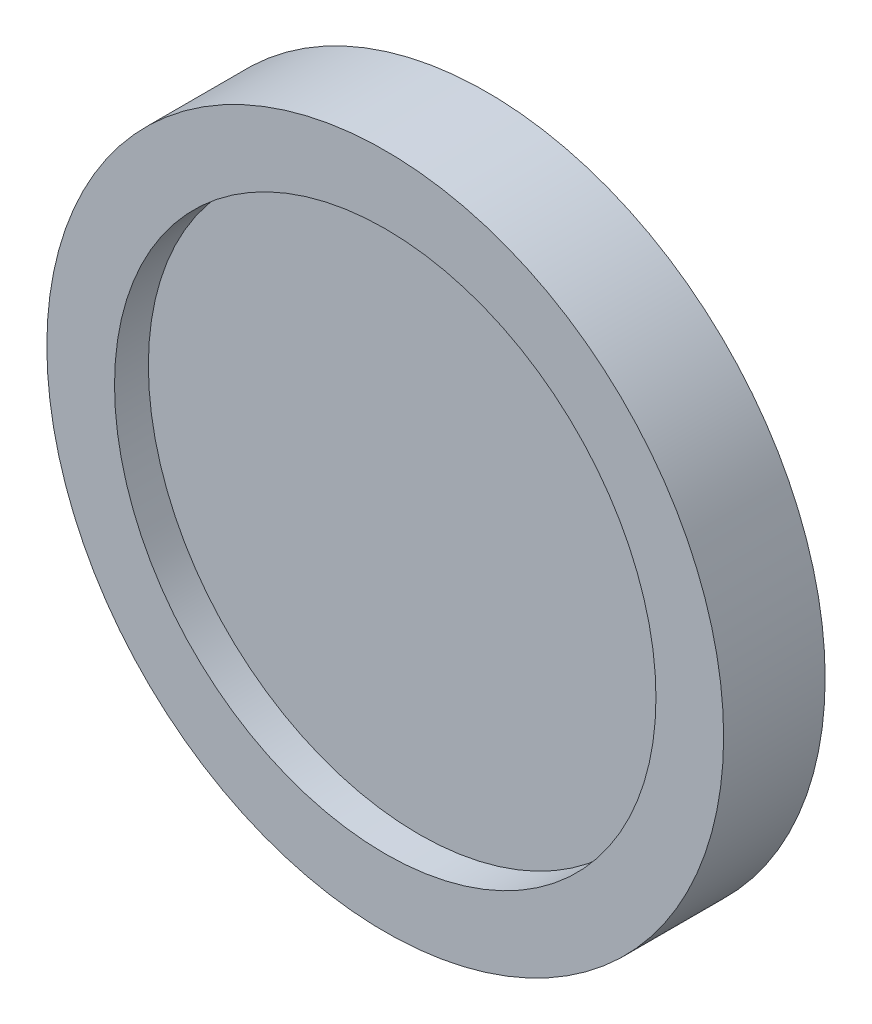
ISO-10303-21;
HEADER;
FILE_DESCRIPTION(('STEP AP214'),'2;1');
FILE_NAME('part.step','',(''),(''),'','','');
FILE_SCHEMA(('AUTOMOTIVE_DESIGN { 1 0 10303 214 1 1 1 1 }'));
ENDSEC;
DATA;
#1=APPLICATION_CONTEXT('core data for automotive mechanical design processes');
#2=APPLICATION_PROTOCOL_DEFINITION('international standard','automotive_design',2000,#1);
#3=PRODUCT_CONTEXT('',#1,'mechanical');
#4=PRODUCT('Part','Part','',(#3));
#5=PRODUCT_RELATED_PRODUCT_CATEGORY('part','',(#4));
#6=PRODUCT_DEFINITION_FORMATION('','',#4);
#7=PRODUCT_DEFINITION_CONTEXT('part definition',#1,'design');
#8=PRODUCT_DEFINITION('design','',#6,#7);
#9=PRODUCT_DEFINITION_SHAPE('','',#8);
#10=(LENGTH_UNIT() NAMED_UNIT(*) SI_UNIT(.MILLI.,.METRE.));
#11=(NAMED_UNIT(*) PLANE_ANGLE_UNIT() SI_UNIT($,.RADIAN.));
#12=(NAMED_UNIT(*) SI_UNIT($,.STERADIAN.) SOLID_ANGLE_UNIT());
#13=UNCERTAINTY_MEASURE_WITH_UNIT(LENGTH_MEASURE(1.E-05),#10,'distance_accuracy_value','');
#14=(GEOMETRIC_REPRESENTATION_CONTEXT(3) GLOBAL_UNCERTAINTY_ASSIGNED_CONTEXT((#13)) GLOBAL_UNIT_ASSIGNED_CONTEXT((#10,
#11,#12)) REPRESENTATION_CONTEXT('',''));
#15=CARTESIAN_POINT('',(0.,0.,0.));
#16=DIRECTION('',(0.,0.,1.));
#17=DIRECTION('',(1.,0.,0.));
#18=AXIS2_PLACEMENT_3D('',#15,#16,#17);
#19=CARTESIAN_POINT('',(0.,0.,15.));
#20=DIRECTION('',(0.,0.,-1.));
#21=DIRECTION('',(-1.,0.,0.));
#22=AXIS2_PLACEMENT_3D('',#19,#20,#21);
#23=CYLINDRICAL_SURFACE('',#22,50.);
#24=CARTESIAN_POINT('',(0.,0.,15.));
#25=DIRECTION('',(0.,0.,1.));
#26=DIRECTION('',(1.,0.,0.));
#27=AXIS2_PLACEMENT_3D('',#24,#25,#26);
#28=CIRCLE('',#27,50.);
#29=CARTESIAN_POINT('',(50.,0.,15.));
#30=VERTEX_POINT('',#29);
#31=EDGE_CURVE('E10',#30,#30,#28,.T.);
#32=ORIENTED_EDGE('',*,*,#31,.F.);
#33=EDGE_LOOP('',(#32));
#34=FACE_BOUND('',#33,.T.);
#35=CARTESIAN_POINT('',(0.,0.,0.));
#36=DIRECTION('',(0.,0.,1.));
#37=DIRECTION('',(1.,0.,0.));
#38=AXIS2_PLACEMENT_3D('',#35,#36,#37);
#39=CIRCLE('',#38,50.);
#40=CARTESIAN_POINT('',(50.,0.,0.));
#41=VERTEX_POINT('',#40);
#42=EDGE_CURVE('E40',#41,#41,#39,.T.);
#43=ORIENTED_EDGE('',*,*,#42,.T.);
#44=EDGE_LOOP('',(#43));
#45=FACE_BOUND('',#44,.T.);
#46=ADVANCED_FACE('F37',(#34,#45),#23,.T.);
#47=CARTESIAN_POINT('',(0.,0.,15.));
#48=DIRECTION('',(0.,0.,1.));
#49=DIRECTION('',(1.,0.,0.));
#50=AXIS2_PLACEMENT_3D('',#47,#48,#49);
#51=PLANE('',#50);
#52=CARTESIAN_POINT('',(0.,0.,15.));
#53=DIRECTION('',(0.,0.,1.));
#54=DIRECTION('',(1.,0.,0.));
#55=AXIS2_PLACEMENT_3D('',#52,#53,#54);
#56=CIRCLE('',#55,40.);
#57=CARTESIAN_POINT('',(40.,0.,15.));
#58=VERTEX_POINT('',#57);
#59=EDGE_CURVE('E49',#58,#58,#56,.T.);
#60=ORIENTED_EDGE('',*,*,#59,.F.);
#61=EDGE_LOOP('',(#60));
#62=FACE_BOUND('',#61,.T.);
#63=ORIENTED_EDGE('',*,*,#31,.T.);
#64=EDGE_LOOP('',(#63));
#65=FACE_BOUND('',#64,.T.);
#66=ADVANCED_FACE('F71',(#62,#65),#51,.T.);
#67=CARTESIAN_POINT('',(0.,0.,0.));
#68=DIRECTION('',(0.,0.,1.));
#69=DIRECTION('',(1.,0.,0.));
#70=AXIS2_PLACEMENT_3D('',#67,#68,#69);
#71=PLANE('',#70);
#72=ORIENTED_EDGE('',*,*,#42,.F.);
#73=EDGE_LOOP('',(#72));
#74=FACE_BOUND('',#73,.T.);
#75=ADVANCED_FACE('F63',(#74),#71,.F.);
#76=CARTESIAN_POINT('',(0.,0.,15.));
#77=DIRECTION('',(0.,0.,-1.));
#78=DIRECTION('',(-1.,0.,0.));
#79=AXIS2_PLACEMENT_3D('',#76,#77,#78);
#80=CYLINDRICAL_SURFACE('',#79,40.);
#81=ORIENTED_EDGE('',*,*,#59,.T.);
#82=EDGE_LOOP('',(#81));
#83=FACE_BOUND('',#82,.T.);
#84=CARTESIAN_POINT('',(0.,0.,10.));
#85=DIRECTION('',(0.,0.,1.));
#86=DIRECTION('',(1.,0.,0.));
#87=AXIS2_PLACEMENT_3D('',#84,#85,#86);
#88=CIRCLE('',#87,40.);
#89=CARTESIAN_POINT('',(40.,0.,10.));
#90=VERTEX_POINT('',#89);
#91=EDGE_CURVE('E54',#90,#90,#88,.T.);
#92=ORIENTED_EDGE('',*,*,#91,.F.);
#93=EDGE_LOOP('',(#92));
#94=FACE_BOUND('',#93,.T.);
#95=ADVANCED_FACE('F61',(#83,#94),#80,.F.);
#96=CARTESIAN_POINT('',(0.,0.,10.));
#97=DIRECTION('',(0.,0.,1.));
#98=DIRECTION('',(1.,0.,0.));
#99=AXIS2_PLACEMENT_3D('',#96,#97,#98);
#100=PLANE('',#99);
#101=ORIENTED_EDGE('',*,*,#91,.T.);
#102=EDGE_LOOP('',(#101));
#103=FACE_BOUND('',#102,.T.);
#104=ADVANCED_FACE('F59',(#103),#100,.T.);
#105=CLOSED_SHELL('',(#46,#66,#75,#95,#104));
#106=MANIFOLD_SOLID_BREP('B2',#105);
#107=ADVANCED_BREP_SHAPE_REPRESENTATION('',(#18,#106),#14);
#108=SHAPE_DEFINITION_REPRESENTATION(#9,#107);
ENDSEC;
END-ISO-10303-21;
